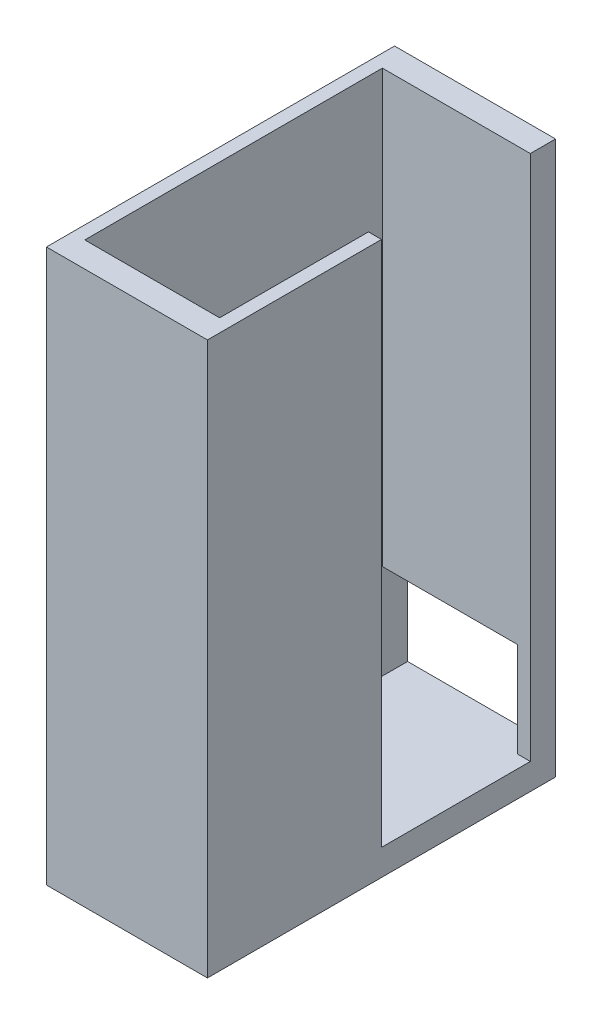
ISO-10303-21;
HEADER;
FILE_DESCRIPTION(('STEP AP214'),'2;1');
FILE_NAME('part.step','',(''),(''),'','','');
FILE_SCHEMA(('AUTOMOTIVE_DESIGN { 1 0 10303 214 1 1 1 1 }'));
ENDSEC;
DATA;
#1=APPLICATION_CONTEXT('core data for automotive mechanical design processes');
#2=APPLICATION_PROTOCOL_DEFINITION('international standard','automotive_design',2000,#1);
#3=PRODUCT_CONTEXT('',#1,'mechanical');
#4=PRODUCT('Part','Part','',(#3));
#5=PRODUCT_RELATED_PRODUCT_CATEGORY('part','',(#4));
#6=PRODUCT_DEFINITION_FORMATION('','',#4);
#7=PRODUCT_DEFINITION_CONTEXT('part definition',#1,'design');
#8=PRODUCT_DEFINITION('design','',#6,#7);
#9=PRODUCT_DEFINITION_SHAPE('','',#8);
#10=(LENGTH_UNIT() NAMED_UNIT(*) SI_UNIT(.MILLI.,.METRE.));
#11=(NAMED_UNIT(*) PLANE_ANGLE_UNIT() SI_UNIT($,.RADIAN.));
#12=(NAMED_UNIT(*) SI_UNIT($,.STERADIAN.) SOLID_ANGLE_UNIT());
#13=UNCERTAINTY_MEASURE_WITH_UNIT(LENGTH_MEASURE(1.E-05),#10,'distance_accuracy_value','');
#14=(GEOMETRIC_REPRESENTATION_CONTEXT(3) GLOBAL_UNCERTAINTY_ASSIGNED_CONTEXT((#13)) GLOBAL_UNIT_ASSIGNED_CONTEXT((#10,
#11,#12)) REPRESENTATION_CONTEXT('',''));
#15=CARTESIAN_POINT('',(0.,0.,0.));
#16=DIRECTION('',(0.,0.,1.));
#17=DIRECTION('',(1.,0.,0.));
#18=AXIS2_PLACEMENT_3D('',#15,#16,#17);
#19=CARTESIAN_POINT('',(18.5,63.5,-37.1));
#20=DIRECTION('',(0.,0.,1.));
#21=DIRECTION('',(1.,0.,0.));
#22=AXIS2_PLACEMENT_3D('',#19,#20,#21);
#23=PLANE('',#22);
#24=DIRECTION('',(1.,0.,0.));
#25=VECTOR('',#24,1.);
#26=CARTESIAN_POINT('',(17.,13.9,-37.1));
#27=LINE('',#26,#25);
#28=CARTESIAN_POINT('',(1.5,13.9,-37.1));
#29=VERTEX_POINT('',#28);
#30=CARTESIAN_POINT('',(17.,13.9,-37.1));
#31=VERTEX_POINT('',#30);
#32=EDGE_CURVE('E165',#29,#31,#27,.T.);
#33=ORIENTED_EDGE('',*,*,#32,.T.);
#34=DIRECTION('',(0.,-1.,0.));
#35=VECTOR('',#34,1.);
#36=CARTESIAN_POINT('',(17.,3.,-37.1));
#37=LINE('',#36,#35);
#38=CARTESIAN_POINT('',(17.,3.,-37.1));
#39=VERTEX_POINT('',#38);
#40=EDGE_CURVE('E167',#31,#39,#37,.T.);
#41=ORIENTED_EDGE('',*,*,#40,.T.);
#42=DIRECTION('',(-1.,0.,0.));
#43=VECTOR('',#42,1.);
#44=CARTESIAN_POINT('',(18.5,3.,-37.1));
#45=LINE('',#44,#43);
#46=CARTESIAN_POINT('',(18.5,3.,-37.1));
#47=VERTEX_POINT('',#46);
#48=EDGE_CURVE('E178',#47,#39,#45,.T.);
#49=ORIENTED_EDGE('',*,*,#48,.F.);
#50=DIRECTION('',(0.,-1.,0.));
#51=VECTOR('',#50,1.);
#52=CARTESIAN_POINT('',(18.5,63.5,-37.1));
#53=LINE('',#52,#51);
#54=CARTESIAN_POINT('',(18.5,63.5,-37.1));
#55=VERTEX_POINT('',#54);
#56=EDGE_CURVE('E183',#55,#47,#53,.T.);
#57=ORIENTED_EDGE('',*,*,#56,.F.);
#58=DIRECTION('',(-1.,0.,0.));
#59=VECTOR('',#58,1.);
#60=CARTESIAN_POINT('',(18.5,63.5,-37.1));
#61=LINE('',#60,#59);
#62=CARTESIAN_POINT('',(1.5,63.5,-37.1));
#63=VERTEX_POINT('',#62);
#64=EDGE_CURVE('E175',#55,#63,#61,.T.);
#65=ORIENTED_EDGE('',*,*,#64,.T.);
#66=DIRECTION('',(0.,-1.,0.));
#67=VECTOR('',#66,1.);
#68=CARTESIAN_POINT('',(1.5,63.5,-37.1));
#69=LINE('',#68,#67);
#70=EDGE_CURVE('E188',#63,#29,#69,.T.);
#71=ORIENTED_EDGE('',*,*,#70,.T.);
#72=EDGE_LOOP('',(#33,#41,#49,#57,#65,#71));
#73=FACE_BOUND('',#72,.T.);
#74=ADVANCED_FACE('F41',(#73),#23,.T.);
#75=CARTESIAN_POINT('',(0.,3.,0.));
#76=DIRECTION('',(1.,0.,0.));
#77=DIRECTION('',(0.,0.,-1.));
#78=AXIS2_PLACEMENT_3D('',#75,#76,#77);
#79=PLANE('',#78);
#80=DIRECTION('',(0.,0.,1.));
#81=VECTOR('',#80,1.);
#82=CARTESIAN_POINT('',(0.,0.,0.));
#83=LINE('',#82,#81);
#84=CARTESIAN_POINT('',(0.,0.,-40.));
#85=VERTEX_POINT('',#84);
#86=CARTESIAN_POINT('',(0.,0.,0.));
#87=VERTEX_POINT('',#86);
#88=EDGE_CURVE('E197',#85,#87,#83,.T.);
#89=ORIENTED_EDGE('',*,*,#88,.T.);
#90=DIRECTION('',(0.,-1.,0.));
#91=VECTOR('',#90,1.);
#92=CARTESIAN_POINT('',(0.,3.,0.));
#93=LINE('',#92,#91);
#94=CARTESIAN_POINT('',(0.,63.5,0.));
#95=VERTEX_POINT('',#94);
#96=EDGE_CURVE('E11',#95,#87,#93,.T.);
#97=ORIENTED_EDGE('',*,*,#96,.F.);
#98=DIRECTION('',(0.,0.,-1.));
#99=VECTOR('',#98,1.);
#100=CARTESIAN_POINT('',(0.,63.5,-37.1));
#101=LINE('',#100,#99);
#102=CARTESIAN_POINT('',(0.,63.5,-40.));
#103=VERTEX_POINT('',#102);
#104=EDGE_CURVE('E174',#95,#103,#101,.T.);
#105=ORIENTED_EDGE('',*,*,#104,.T.);
#106=DIRECTION('',(0.,-1.,0.));
#107=VECTOR('',#106,1.);
#108=CARTESIAN_POINT('',(0.,3.,-40.));
#109=LINE('',#108,#107);
#110=EDGE_CURVE('E226',#103,#85,#109,.T.);
#111=ORIENTED_EDGE('',*,*,#110,.T.);
#112=EDGE_LOOP('',(#89,#97,#105,#111));
#113=FACE_BOUND('',#112,.T.);
#114=ADVANCED_FACE('F43',(#113),#79,.F.);
#115=CARTESIAN_POINT('',(0.,3.,0.));
#116=DIRECTION('',(0.,0.,-1.));
#117=DIRECTION('',(-1.,0.,0.));
#118=AXIS2_PLACEMENT_3D('',#115,#116,#117);
#119=PLANE('',#118);
#120=DIRECTION('',(1.,0.,0.));
#121=VECTOR('',#120,1.);
#122=CARTESIAN_POINT('',(0.,0.,0.));
#123=LINE('',#122,#121);
#124=CARTESIAN_POINT('',(18.5,0.,0.));
#125=VERTEX_POINT('',#124);
#126=EDGE_CURVE('E229',#87,#125,#123,.T.);
#127=ORIENTED_EDGE('',*,*,#126,.T.);
#128=DIRECTION('',(0.,-1.,0.));
#129=VECTOR('',#128,1.);
#130=CARTESIAN_POINT('',(18.5,3.,0.));
#131=LINE('',#130,#129);
#132=CARTESIAN_POINT('',(18.5,63.5,0.));
#133=VERTEX_POINT('',#132);
#134=EDGE_CURVE('E47',#133,#125,#131,.T.);
#135=ORIENTED_EDGE('',*,*,#134,.F.);
#136=DIRECTION('',(1.,0.,0.));
#137=VECTOR('',#136,1.);
#138=CARTESIAN_POINT('',(0.,63.5,0.));
#139=LINE('',#138,#137);
#140=EDGE_CURVE('E142',#95,#133,#139,.T.);
#141=ORIENTED_EDGE('',*,*,#140,.F.);
#142=ORIENTED_EDGE('',*,*,#96,.T.);
#143=EDGE_LOOP('',(#127,#135,#141,#142));
#144=FACE_BOUND('',#143,.T.);
#145=ADVANCED_FACE('F256',(#144),#119,.F.);
#146=CARTESIAN_POINT('',(18.5,3.,0.));
#147=DIRECTION('',(-1.,0.,0.));
#148=DIRECTION('',(0.,0.,1.));
#149=AXIS2_PLACEMENT_3D('',#146,#147,#148);
#150=PLANE('',#149);
#151=DIRECTION('',(0.,0.,-1.));
#152=VECTOR('',#151,1.);
#153=CARTESIAN_POINT('',(18.5,0.,0.));
#154=LINE('',#153,#152);
#155=CARTESIAN_POINT('',(18.5,0.,-40.));
#156=VERTEX_POINT('',#155);
#157=EDGE_CURVE('E235',#125,#156,#154,.T.);
#158=ORIENTED_EDGE('',*,*,#157,.T.);
#159=DIRECTION('',(0.,-1.,0.));
#160=VECTOR('',#159,1.);
#161=CARTESIAN_POINT('',(18.5,3.,-40.));
#162=LINE('',#161,#160);
#163=CARTESIAN_POINT('',(18.5,63.5,-40.));
#164=VERTEX_POINT('',#163);
#165=EDGE_CURVE('E240',#164,#156,#162,.T.);
#166=ORIENTED_EDGE('',*,*,#165,.F.);
#167=DIRECTION('',(0.,0.,1.));
#168=VECTOR('',#167,1.);
#169=CARTESIAN_POINT('',(18.5,63.5,-40.));
#170=LINE('',#169,#168);
#171=EDGE_CURVE('E185',#164,#55,#170,.T.);
#172=ORIENTED_EDGE('',*,*,#171,.T.);
#173=ORIENTED_EDGE('',*,*,#56,.T.);
#174=DIRECTION('',(0.,0.,-1.));
#175=VECTOR('',#174,1.);
#176=CARTESIAN_POINT('',(18.5,3.,0.));
#177=LINE('',#176,#175);
#178=CARTESIAN_POINT('',(18.5,3.,-20.));
#179=VERTEX_POINT('',#178);
#180=EDGE_CURVE('E221',#179,#47,#177,.T.);
#181=ORIENTED_EDGE('',*,*,#180,.F.);
#182=DIRECTION('',(0.,-1.,0.));
#183=VECTOR('',#182,1.);
#184=CARTESIAN_POINT('',(18.5,63.5,-20.));
#185=LINE('',#184,#183);
#186=CARTESIAN_POINT('',(18.5,63.5,-20.));
#187=VERTEX_POINT('',#186);
#188=EDGE_CURVE('E141',#187,#179,#185,.T.);
#189=ORIENTED_EDGE('',*,*,#188,.F.);
#190=DIRECTION('',(0.,0.,-1.));
#191=VECTOR('',#190,1.);
#192=CARTESIAN_POINT('',(18.5,63.5,-2.9));
#193=LINE('',#192,#191);
#194=EDGE_CURVE('E204',#133,#187,#193,.T.);
#195=ORIENTED_EDGE('',*,*,#194,.F.);
#196=ORIENTED_EDGE('',*,*,#134,.T.);
#197=EDGE_LOOP('',(#158,#166,#172,#173,#181,#189,#195,#196));
#198=FACE_BOUND('',#197,.T.);
#199=ADVANCED_FACE('F242',(#198),#150,.F.);
#200=CARTESIAN_POINT('',(0.,3.,-40.));
#201=DIRECTION('',(0.,0.,1.));
#202=DIRECTION('',(1.,0.,0.));
#203=AXIS2_PLACEMENT_3D('',#200,#201,#202);
#204=PLANE('',#203);
#205=DIRECTION('',(1.,0.,0.));
#206=VECTOR('',#205,1.);
#207=CARTESIAN_POINT('',(17.,13.9,-40.));
#208=LINE('',#207,#206);
#209=CARTESIAN_POINT('',(1.49999999999999,13.9,-40.));
#210=VERTEX_POINT('',#209);
#211=CARTESIAN_POINT('',(17.,13.9,-40.));
#212=VERTEX_POINT('',#211);
#213=EDGE_CURVE('E157',#210,#212,#208,.T.);
#214=ORIENTED_EDGE('',*,*,#213,.F.);
#215=DIRECTION('',(0.,1.,0.));
#216=VECTOR('',#215,1.);
#217=CARTESIAN_POINT('',(1.49999999999999,13.9,-40.));
#218=LINE('',#217,#216);
#219=CARTESIAN_POINT('',(1.49999999999999,3.,-40.));
#220=VERTEX_POINT('',#219);
#221=EDGE_CURVE('E63',#220,#210,#218,.T.);
#222=ORIENTED_EDGE('',*,*,#221,.F.);
#223=DIRECTION('',(-1.,0.,0.));
#224=VECTOR('',#223,1.);
#225=CARTESIAN_POINT('',(1.49999999999999,3.,-40.));
#226=LINE('',#225,#224);
#227=CARTESIAN_POINT('',(17.,3.,-40.));
#228=VERTEX_POINT('',#227);
#229=EDGE_CURVE('E148',#228,#220,#226,.T.);
#230=ORIENTED_EDGE('',*,*,#229,.F.);
#231=DIRECTION('',(0.,-1.,0.));
#232=VECTOR('',#231,1.);
#233=CARTESIAN_POINT('',(17.,3.,-40.));
#234=LINE('',#233,#232);
#235=EDGE_CURVE('E152',#212,#228,#234,.T.);
#236=ORIENTED_EDGE('',*,*,#235,.F.);
#237=EDGE_LOOP('',(#214,#222,#230,#236));
#238=FACE_BOUND('',#237,.T.);
#239=DIRECTION('',(-1.,0.,0.));
#240=VECTOR('',#239,1.);
#241=CARTESIAN_POINT('',(0.,0.,-40.));
#242=LINE('',#241,#240);
#243=EDGE_CURVE('E230',#156,#85,#242,.T.);
#244=ORIENTED_EDGE('',*,*,#243,.T.);
#245=ORIENTED_EDGE('',*,*,#110,.F.);
#246=DIRECTION('',(1.,0.,0.));
#247=VECTOR('',#246,1.);
#248=CARTESIAN_POINT('',(0.,63.5,-40.));
#249=LINE('',#248,#247);
#250=EDGE_CURVE('E179',#103,#164,#249,.T.);
#251=ORIENTED_EDGE('',*,*,#250,.T.);
#252=ORIENTED_EDGE('',*,*,#165,.T.);
#253=EDGE_LOOP('',(#244,#245,#251,#252));
#254=FACE_BOUND('',#253,.T.);
#255=ADVANCED_FACE('F160',(#238,#254),#204,.F.);
#256=CARTESIAN_POINT('',(0.,3.,0.));
#257=DIRECTION('',(0.,-1.,0.));
#258=DIRECTION('',(0.,0.,-1.));
#259=AXIS2_PLACEMENT_3D('',#256,#257,#258);
#260=PLANE('',#259);
#261=ORIENTED_EDGE('',*,*,#180,.T.);
#262=ORIENTED_EDGE('',*,*,#48,.T.);
#263=DIRECTION('',(0.,0.,-1.));
#264=VECTOR('',#263,1.);
#265=CARTESIAN_POINT('',(17.,3.,0.001000000000001));
#266=LINE('',#265,#264);
#267=EDGE_CURVE('E149',#39,#228,#266,.T.);
#268=ORIENTED_EDGE('',*,*,#267,.T.);
#269=ORIENTED_EDGE('',*,*,#229,.T.);
#270=DIRECTION('',(0.,0.,-1.));
#271=VECTOR('',#270,1.);
#272=CARTESIAN_POINT('',(1.5,3.,0.));
#273=LINE('',#272,#271);
#274=CARTESIAN_POINT('',(1.5,3.,-2.9));
#275=VERTEX_POINT('',#274);
#276=EDGE_CURVE('E134',#275,#220,#273,.T.);
#277=ORIENTED_EDGE('',*,*,#276,.F.);
#278=DIRECTION('',(-1.,0.,0.));
#279=VECTOR('',#278,1.);
#280=CARTESIAN_POINT('',(18.5,3.,-2.9));
#281=LINE('',#280,#279);
#282=CARTESIAN_POINT('',(17.,3.,-2.9));
#283=VERTEX_POINT('',#282);
#284=EDGE_CURVE('E153',#283,#275,#281,.T.);
#285=ORIENTED_EDGE('',*,*,#284,.F.);
#286=DIRECTION('',(0.,0.,1.));
#287=VECTOR('',#286,1.);
#288=CARTESIAN_POINT('',(17.,3.,-20.));
#289=LINE('',#288,#287);
#290=CARTESIAN_POINT('',(17.,3.,-20.));
#291=VERTEX_POINT('',#290);
#292=EDGE_CURVE('E210',#291,#283,#289,.T.);
#293=ORIENTED_EDGE('',*,*,#292,.F.);
#294=DIRECTION('',(-1.,0.,0.));
#295=VECTOR('',#294,1.);
#296=CARTESIAN_POINT('',(18.5,3.,-20.));
#297=LINE('',#296,#295);
#298=EDGE_CURVE('E205',#179,#291,#297,.T.);
#299=ORIENTED_EDGE('',*,*,#298,.F.);
#300=EDGE_LOOP('',(#261,#262,#268,#269,#277,#285,#293,#299));
#301=FACE_BOUND('',#300,.T.);
#302=ADVANCED_FACE('F150',(#301),#260,.F.);
#303=CARTESIAN_POINT('',(0.,0.,0.));
#304=DIRECTION('',(0.,-1.,0.));
#305=DIRECTION('',(0.,0.,-1.));
#306=AXIS2_PLACEMENT_3D('',#303,#304,#305);
#307=PLANE('',#306);
#308=ORIENTED_EDGE('',*,*,#88,.F.);
#309=ORIENTED_EDGE('',*,*,#243,.F.);
#310=ORIENTED_EDGE('',*,*,#157,.F.);
#311=ORIENTED_EDGE('',*,*,#126,.F.);
#312=EDGE_LOOP('',(#308,#309,#310,#311));
#313=FACE_BOUND('',#312,.T.);
#314=ADVANCED_FACE('F247',(#313),#307,.T.);
#315=CARTESIAN_POINT('',(0.,63.5,0.));
#316=DIRECTION('',(0.,-1.,0.));
#317=DIRECTION('',(0.,0.,-1.));
#318=AXIS2_PLACEMENT_3D('',#315,#316,#317);
#319=PLANE('',#318);
#320=ORIENTED_EDGE('',*,*,#64,.F.);
#321=ORIENTED_EDGE('',*,*,#171,.F.);
#322=ORIENTED_EDGE('',*,*,#250,.F.);
#323=ORIENTED_EDGE('',*,*,#104,.F.);
#324=ORIENTED_EDGE('',*,*,#140,.T.);
#325=ORIENTED_EDGE('',*,*,#194,.T.);
#326=DIRECTION('',(-1.,0.,0.));
#327=VECTOR('',#326,1.);
#328=CARTESIAN_POINT('',(18.5,63.5,-20.));
#329=LINE('',#328,#327);
#330=CARTESIAN_POINT('',(17.,63.5,-20.));
#331=VERTEX_POINT('',#330);
#332=EDGE_CURVE('E203',#187,#331,#329,.T.);
#333=ORIENTED_EDGE('',*,*,#332,.T.);
#334=DIRECTION('',(0.,0.,1.));
#335=VECTOR('',#334,1.);
#336=CARTESIAN_POINT('',(17.,63.5,-20.));
#337=LINE('',#336,#335);
#338=CARTESIAN_POINT('',(17.,63.5,-2.9));
#339=VERTEX_POINT('',#338);
#340=EDGE_CURVE('E196',#331,#339,#337,.T.);
#341=ORIENTED_EDGE('',*,*,#340,.T.);
#342=DIRECTION('',(-1.,0.,0.));
#343=VECTOR('',#342,1.);
#344=CARTESIAN_POINT('',(18.5,63.5,-2.9));
#345=LINE('',#344,#343);
#346=CARTESIAN_POINT('',(1.5,63.5,-2.9));
#347=VERTEX_POINT('',#346);
#348=EDGE_CURVE('E209',#339,#347,#345,.T.);
#349=ORIENTED_EDGE('',*,*,#348,.T.);
#350=DIRECTION('',(0.,0.,-1.));
#351=VECTOR('',#350,1.);
#352=CARTESIAN_POINT('',(1.5,63.5,0.));
#353=LINE('',#352,#351);
#354=EDGE_CURVE('E195',#347,#63,#353,.T.);
#355=ORIENTED_EDGE('',*,*,#354,.T.);
#356=EDGE_LOOP('',(#320,#321,#322,#323,#324,#325,#333,#341,#349,#355));
#357=FACE_BOUND('',#356,.T.);
#358=ADVANCED_FACE('F258',(#357),#319,.F.);
#359=CARTESIAN_POINT('',(18.5,63.5,-20.));
#360=DIRECTION('',(0.,0.,1.));
#361=DIRECTION('',(1.,0.,0.));
#362=AXIS2_PLACEMENT_3D('',#359,#360,#361);
#363=PLANE('',#362);
#364=ORIENTED_EDGE('',*,*,#298,.T.);
#365=DIRECTION('',(0.,-1.,0.));
#366=VECTOR('',#365,1.);
#367=CARTESIAN_POINT('',(17.,63.5,-20.));
#368=LINE('',#367,#366);
#369=EDGE_CURVE('E214',#331,#291,#368,.T.);
#370=ORIENTED_EDGE('',*,*,#369,.F.);
#371=ORIENTED_EDGE('',*,*,#332,.F.);
#372=ORIENTED_EDGE('',*,*,#188,.T.);
#373=EDGE_LOOP('',(#364,#370,#371,#372));
#374=FACE_BOUND('',#373,.T.);
#375=ADVANCED_FACE('F278',(#374),#363,.F.);
#376=CARTESIAN_POINT('',(17.,63.5,-20.));
#377=DIRECTION('',(1.,0.,0.));
#378=DIRECTION('',(0.,0.,-1.));
#379=AXIS2_PLACEMENT_3D('',#376,#377,#378);
#380=PLANE('',#379);
#381=ORIENTED_EDGE('',*,*,#292,.T.);
#382=DIRECTION('',(0.,-1.,0.));
#383=VECTOR('',#382,1.);
#384=CARTESIAN_POINT('',(17.,63.5,-2.9));
#385=LINE('',#384,#383);
#386=EDGE_CURVE('E206',#339,#283,#385,.T.);
#387=ORIENTED_EDGE('',*,*,#386,.F.);
#388=ORIENTED_EDGE('',*,*,#340,.F.);
#389=ORIENTED_EDGE('',*,*,#369,.T.);
#390=EDGE_LOOP('',(#381,#387,#388,#389));
#391=FACE_BOUND('',#390,.T.);
#392=ADVANCED_FACE('F282',(#391),#380,.F.);
#393=CARTESIAN_POINT('',(18.5,63.5,-2.9));
#394=DIRECTION('',(0.,0.,1.));
#395=DIRECTION('',(1.,0.,0.));
#396=AXIS2_PLACEMENT_3D('',#393,#394,#395);
#397=PLANE('',#396);
#398=ORIENTED_EDGE('',*,*,#348,.F.);
#399=ORIENTED_EDGE('',*,*,#386,.T.);
#400=ORIENTED_EDGE('',*,*,#284,.T.);
#401=DIRECTION('',(0.,-1.,0.));
#402=VECTOR('',#401,1.);
#403=CARTESIAN_POINT('',(1.5,63.5,-2.9));
#404=LINE('',#403,#402);
#405=EDGE_CURVE('E139',#347,#275,#404,.T.);
#406=ORIENTED_EDGE('',*,*,#405,.F.);
#407=EDGE_LOOP('',(#398,#399,#400,#406));
#408=FACE_BOUND('',#407,.T.);
#409=ADVANCED_FACE('F276',(#408),#397,.F.);
#410=CARTESIAN_POINT('',(1.5,63.5,0.));
#411=DIRECTION('',(-1.,0.,0.));
#412=DIRECTION('',(0.,0.,1.));
#413=AXIS2_PLACEMENT_3D('',#410,#411,#412);
#414=PLANE('',#413);
#415=ORIENTED_EDGE('',*,*,#354,.F.);
#416=ORIENTED_EDGE('',*,*,#405,.T.);
#417=ORIENTED_EDGE('',*,*,#276,.T.);
#418=ORIENTED_EDGE('',*,*,#221,.T.);
#419=DIRECTION('',(0.,0.,-1.));
#420=VECTOR('',#419,1.);
#421=CARTESIAN_POINT('',(1.49999999999999,13.9,0.001000000000001));
#422=LINE('',#421,#420);
#423=EDGE_CURVE('E166',#29,#210,#422,.T.);
#424=ORIENTED_EDGE('',*,*,#423,.F.);
#425=ORIENTED_EDGE('',*,*,#70,.F.);
#426=EDGE_LOOP('',(#415,#416,#417,#418,#424,#425));
#427=FACE_BOUND('',#426,.T.);
#428=ADVANCED_FACE('F136',(#427),#414,.F.);
#429=CARTESIAN_POINT('',(17.,3.,0.001000000000001));
#430=DIRECTION('',(1.,0.,0.));
#431=DIRECTION('',(0.,0.,-1.));
#432=AXIS2_PLACEMENT_3D('',#429,#430,#431);
#433=PLANE('',#432);
#434=DIRECTION('',(0.,0.,-1.));
#435=VECTOR('',#434,1.);
#436=CARTESIAN_POINT('',(17.,13.9,0.001000000000001));
#437=LINE('',#436,#435);
#438=EDGE_CURVE('E57',#31,#212,#437,.T.);
#439=ORIENTED_EDGE('',*,*,#438,.T.);
#440=ORIENTED_EDGE('',*,*,#235,.T.);
#441=ORIENTED_EDGE('',*,*,#267,.F.);
#442=ORIENTED_EDGE('',*,*,#40,.F.);
#443=EDGE_LOOP('',(#439,#440,#441,#442));
#444=FACE_BOUND('',#443,.T.);
#445=ADVANCED_FACE('F279',(#444),#433,.F.);
#446=CARTESIAN_POINT('',(17.,13.9,0.001000000000001));
#447=DIRECTION('',(0.,1.,0.));
#448=DIRECTION('',(0.,0.,1.));
#449=AXIS2_PLACEMENT_3D('',#446,#447,#448);
#450=PLANE('',#449);
#451=ORIENTED_EDGE('',*,*,#423,.T.);
#452=ORIENTED_EDGE('',*,*,#213,.T.);
#453=ORIENTED_EDGE('',*,*,#438,.F.);
#454=ORIENTED_EDGE('',*,*,#32,.F.);
#455=EDGE_LOOP('',(#451,#452,#453,#454));
#456=FACE_BOUND('',#455,.T.);
#457=ADVANCED_FACE('F316',(#456),#450,.F.);
#458=CLOSED_SHELL('',(#74,#114,#145,#199,#255,#302,#314,#358,#375,#392,#409,#428,#445,#457));
#459=MANIFOLD_SOLID_BREP('B2',#458);
#460=ADVANCED_BREP_SHAPE_REPRESENTATION('',(#18,#459),#14);
#461=SHAPE_DEFINITION_REPRESENTATION(#9,#460);
ENDSEC;
END-ISO-10303-21;
